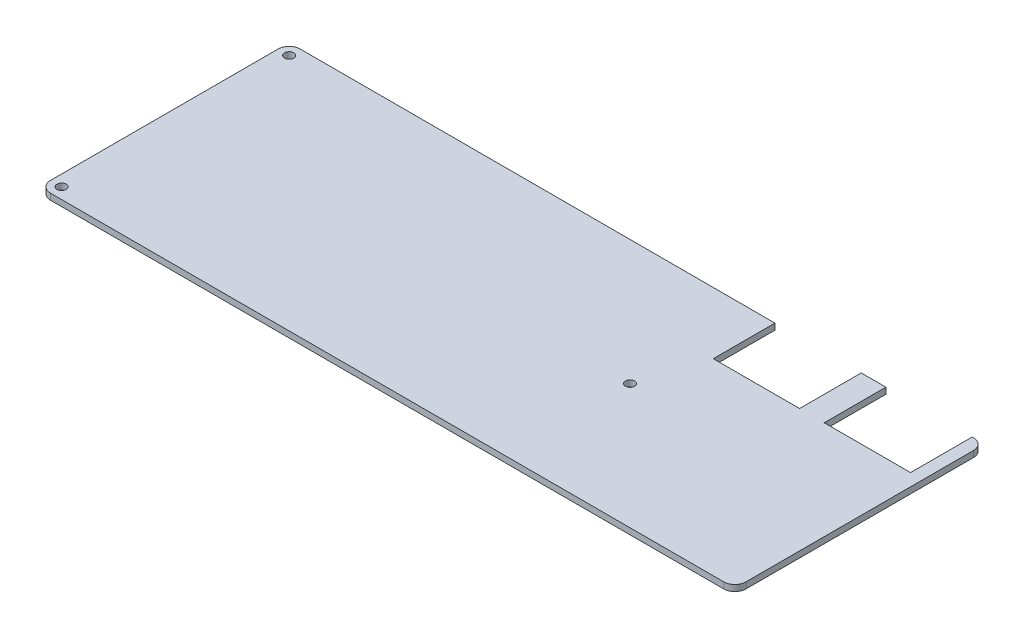
ISO-10303-21;
HEADER;
FILE_DESCRIPTION(('STEP AP214'),'2;1');
FILE_NAME('part.step','',(''),(''),'','','');
FILE_SCHEMA(('AUTOMOTIVE_DESIGN { 1 0 10303 214 1 1 1 1 }'));
ENDSEC;
DATA;
#1=APPLICATION_CONTEXT('core data for automotive mechanical design processes');
#2=APPLICATION_PROTOCOL_DEFINITION('international standard','automotive_design',2000,#1);
#3=PRODUCT_CONTEXT('',#1,'mechanical');
#4=PRODUCT('Part','Part','',(#3));
#5=PRODUCT_RELATED_PRODUCT_CATEGORY('part','',(#4));
#6=PRODUCT_DEFINITION_FORMATION('','',#4);
#7=PRODUCT_DEFINITION_CONTEXT('part definition',#1,'design');
#8=PRODUCT_DEFINITION('design','',#6,#7);
#9=PRODUCT_DEFINITION_SHAPE('','',#8);
#10=(LENGTH_UNIT() NAMED_UNIT(*) SI_UNIT(.MILLI.,.METRE.));
#11=(NAMED_UNIT(*) PLANE_ANGLE_UNIT() SI_UNIT($,.RADIAN.));
#12=(NAMED_UNIT(*) SI_UNIT($,.STERADIAN.) SOLID_ANGLE_UNIT());
#13=UNCERTAINTY_MEASURE_WITH_UNIT(LENGTH_MEASURE(1.E-05),#10,'distance_accuracy_value','');
#14=(GEOMETRIC_REPRESENTATION_CONTEXT(3) GLOBAL_UNCERTAINTY_ASSIGNED_CONTEXT((#13)) GLOBAL_UNIT_ASSIGNED_CONTEXT((#10,
#11,#12)) REPRESENTATION_CONTEXT('',''));
#15=CARTESIAN_POINT('',(0.,0.,0.));
#16=DIRECTION('',(0.,0.,1.));
#17=DIRECTION('',(1.,0.,0.));
#18=AXIS2_PLACEMENT_3D('',#15,#16,#17);
#19=CARTESIAN_POINT('',(-53.2002919708029,1.,21.1624817518249));
#20=DIRECTION('',(0.,-1.,0.));
#21=DIRECTION('',(0.,0.,-1.));
#22=AXIS2_PLACEMENT_3D('',#19,#20,#21);
#23=CYLINDRICAL_SURFACE('',#22,1.8);
#24=CARTESIAN_POINT('',(-53.2002919708029,0.,21.1624817518249));
#25=DIRECTION('',(0.,1.,0.));
#26=DIRECTION('',(0.,0.,1.));
#27=AXIS2_PLACEMENT_3D('',#24,#25,#26);
#28=CIRCLE('',#27,1.8);
#29=CARTESIAN_POINT('',(-53.2002919708029,0.,22.9624817518249));
#30=VERTEX_POINT('',#29);
#31=CARTESIAN_POINT('',(-55.0002919708029,0.,21.1624817518249));
#32=VERTEX_POINT('',#31);
#33=EDGE_CURVE('E193',#30,#32,#28,.F.);
#34=ORIENTED_EDGE('',*,*,#33,.F.);
#35=DIRECTION('',(0.,-1.,0.));
#36=VECTOR('',#35,1.);
#37=CARTESIAN_POINT('',(-53.2002919708029,1.,22.9624817518249));
#38=LINE('',#37,#36);
#39=CARTESIAN_POINT('',(-53.2002919708029,1.,22.9624817518249));
#40=VERTEX_POINT('',#39);
#41=EDGE_CURVE('E11',#40,#30,#38,.T.);
#42=ORIENTED_EDGE('',*,*,#41,.F.);
#43=CARTESIAN_POINT('',(-53.2002919708029,1.,21.1624817518249));
#44=DIRECTION('',(0.,1.,0.));
#45=DIRECTION('',(0.,0.,1.));
#46=AXIS2_PLACEMENT_3D('',#43,#44,#45);
#47=CIRCLE('',#46,1.8);
#48=CARTESIAN_POINT('',(-55.0002919708029,1.,21.1624817518249));
#49=VERTEX_POINT('',#48);
#50=EDGE_CURVE('E477',#40,#49,#47,.F.);
#51=ORIENTED_EDGE('',*,*,#50,.T.);
#52=DIRECTION('',(0.,-1.,0.));
#53=VECTOR('',#52,1.);
#54=CARTESIAN_POINT('',(-55.0002919708029,1.,21.1624817518249));
#55=LINE('',#54,#53);
#56=EDGE_CURVE('E113',#49,#32,#55,.T.);
#57=ORIENTED_EDGE('',*,*,#56,.T.);
#58=EDGE_LOOP('',(#34,#42,#51,#57));
#59=FACE_BOUND('',#58,.T.);
#60=ADVANCED_FACE('F38',(#59),#23,.T.);
#61=CARTESIAN_POINT('',(0.,1.,22.9624817518249));
#62=DIRECTION('',(0.,0.,-1.));
#63=DIRECTION('',(-1.,0.,0.));
#64=AXIS2_PLACEMENT_3D('',#61,#62,#63);
#65=PLANE('',#64);
#66=DIRECTION('',(1.,0.,0.));
#67=VECTOR('',#66,1.);
#68=CARTESIAN_POINT('',(0.,0.,22.9624817518249));
#69=LINE('',#68,#67);
#70=CARTESIAN_POINT('',(55.9997080291971,0.,22.9624817518249));
#71=VERTEX_POINT('',#70);
#72=EDGE_CURVE('E196',#30,#71,#69,.T.);
#73=ORIENTED_EDGE('',*,*,#72,.T.);
#74=DIRECTION('',(0.,-1.,0.));
#75=VECTOR('',#74,1.);
#76=CARTESIAN_POINT('',(55.9997080291971,1.,22.9624817518249));
#77=LINE('',#76,#75);
#78=CARTESIAN_POINT('',(55.9997080291971,1.,22.9624817518249));
#79=VERTEX_POINT('',#78);
#80=EDGE_CURVE('E47',#79,#71,#77,.T.);
#81=ORIENTED_EDGE('',*,*,#80,.F.);
#82=DIRECTION('',(1.,0.,0.));
#83=VECTOR('',#82,1.);
#84=CARTESIAN_POINT('',(0.,1.,22.9624817518249));
#85=LINE('',#84,#83);
#86=EDGE_CURVE('E478',#40,#79,#85,.T.);
#87=ORIENTED_EDGE('',*,*,#86,.F.);
#88=ORIENTED_EDGE('',*,*,#41,.T.);
#89=EDGE_LOOP('',(#73,#81,#87,#88));
#90=FACE_BOUND('',#89,.T.);
#91=ADVANCED_FACE('F266',(#90),#65,.F.);
#92=CARTESIAN_POINT('',(55.9997080291971,1.,21.1624817518249));
#93=DIRECTION('',(0.,-1.,0.));
#94=DIRECTION('',(0.,0.,-1.));
#95=AXIS2_PLACEMENT_3D('',#92,#93,#94);
#96=CYLINDRICAL_SURFACE('',#95,1.8);
#97=CARTESIAN_POINT('',(55.9997080291971,0.,21.1624817518249));
#98=DIRECTION('',(0.,1.,0.));
#99=DIRECTION('',(0.,0.,1.));
#100=AXIS2_PLACEMENT_3D('',#97,#98,#99);
#101=CIRCLE('',#100,1.8);
#102=CARTESIAN_POINT('',(57.7997080291971,0.,21.1624817518249));
#103=VERTEX_POINT('',#102);
#104=EDGE_CURVE('E199',#71,#103,#101,.T.);
#105=ORIENTED_EDGE('',*,*,#104,.T.);
#106=DIRECTION('',(0.,-1.,0.));
#107=VECTOR('',#106,1.);
#108=CARTESIAN_POINT('',(57.7997080291971,1.,21.1624817518249));
#109=LINE('',#108,#107);
#110=CARTESIAN_POINT('',(57.7997080291971,1.,21.1624817518249));
#111=VERTEX_POINT('',#110);
#112=EDGE_CURVE('E256',#111,#103,#109,.T.);
#113=ORIENTED_EDGE('',*,*,#112,.F.);
#114=CARTESIAN_POINT('',(55.9997080291971,1.,21.1624817518249));
#115=DIRECTION('',(0.,1.,0.));
#116=DIRECTION('',(0.,0.,1.));
#117=AXIS2_PLACEMENT_3D('',#114,#115,#116);
#118=CIRCLE('',#117,1.8);
#119=EDGE_CURVE('E262',#79,#111,#118,.T.);
#120=ORIENTED_EDGE('',*,*,#119,.F.);
#121=ORIENTED_EDGE('',*,*,#80,.T.);
#122=EDGE_LOOP('',(#105,#113,#120,#121));
#123=FACE_BOUND('',#122,.T.);
#124=ADVANCED_FACE('F260',(#123),#96,.T.);
#125=CARTESIAN_POINT('',(57.7997080291971,1.,0.));
#126=DIRECTION('',(1.,0.,0.));
#127=DIRECTION('',(0.,0.,-1.));
#128=AXIS2_PLACEMENT_3D('',#125,#126,#127);
#129=PLANE('',#128);
#130=DIRECTION('',(0.,0.,1.));
#131=VECTOR('',#130,1.);
#132=CARTESIAN_POINT('',(57.7997080291971,0.,0.));
#133=LINE('',#132,#131);
#134=CARTESIAN_POINT('',(57.7997080291971,0.,-15.7375182481751));
#135=VERTEX_POINT('',#134);
#136=EDGE_CURVE('E202',#135,#103,#133,.T.);
#137=ORIENTED_EDGE('',*,*,#136,.F.);
#138=DIRECTION('',(0.,-1.,0.));
#139=VECTOR('',#138,1.);
#140=CARTESIAN_POINT('',(57.7997080291971,1.,-15.7375182481751));
#141=LINE('',#140,#139);
#142=CARTESIAN_POINT('',(57.7997080291971,1.,-15.7375182481751));
#143=VERTEX_POINT('',#142);
#144=EDGE_CURVE('E254',#143,#135,#141,.T.);
#145=ORIENTED_EDGE('',*,*,#144,.F.);
#146=DIRECTION('',(0.,0.,1.));
#147=VECTOR('',#146,1.);
#148=CARTESIAN_POINT('',(57.7997080291971,1.,0.));
#149=LINE('',#148,#147);
#150=EDGE_CURVE('E487',#143,#111,#149,.T.);
#151=ORIENTED_EDGE('',*,*,#150,.T.);
#152=ORIENTED_EDGE('',*,*,#112,.T.);
#153=EDGE_LOOP('',(#137,#145,#151,#152));
#154=FACE_BOUND('',#153,.T.);
#155=ADVANCED_FACE('F341',(#154),#129,.T.);
#156=CARTESIAN_POINT('',(55.9997080291971,1.,-15.7375182481751));
#157=DIRECTION('',(0.,-1.,0.));
#158=DIRECTION('',(0.,0.,-1.));
#159=AXIS2_PLACEMENT_3D('',#156,#157,#158);
#160=CYLINDRICAL_SURFACE('',#159,1.8);
#161=CARTESIAN_POINT('',(55.9997080291971,0.,-15.7375182481751));
#162=DIRECTION('',(0.,1.,0.));
#163=DIRECTION('',(0.,0.,1.));
#164=AXIS2_PLACEMENT_3D('',#161,#162,#163);
#165=CIRCLE('',#164,1.8);
#166=CARTESIAN_POINT('',(55.9997080291971,0.,-17.5375182481751));
#167=VERTEX_POINT('',#166);
#168=EDGE_CURVE('E205',#135,#167,#165,.T.);
#169=ORIENTED_EDGE('',*,*,#168,.T.);
#170=DIRECTION('',(0.,-1.,0.));
#171=VECTOR('',#170,1.);
#172=CARTESIAN_POINT('',(55.9997080291971,1.,-17.5375182481751));
#173=LINE('',#172,#171);
#174=CARTESIAN_POINT('',(55.9997080291971,1.,-17.5375182481751));
#175=VERTEX_POINT('',#174);
#176=EDGE_CURVE('E252',#175,#167,#173,.T.);
#177=ORIENTED_EDGE('',*,*,#176,.F.);
#178=CARTESIAN_POINT('',(55.9997080291971,1.,-15.7375182481751));
#179=DIRECTION('',(0.,1.,0.));
#180=DIRECTION('',(0.,0.,1.));
#181=AXIS2_PLACEMENT_3D('',#178,#179,#180);
#182=CIRCLE('',#181,1.8);
#183=EDGE_CURVE('E490',#143,#175,#182,.T.);
#184=ORIENTED_EDGE('',*,*,#183,.F.);
#185=ORIENTED_EDGE('',*,*,#144,.T.);
#186=EDGE_LOOP('',(#169,#177,#184,#185));
#187=FACE_BOUND('',#186,.T.);
#188=ADVANCED_FACE('F338',(#187),#160,.T.);
#189=CARTESIAN_POINT('',(0.,1.,-17.5375182481751));
#190=DIRECTION('',(0.,0.,-1.));
#191=DIRECTION('',(-1.,0.,0.));
#192=AXIS2_PLACEMENT_3D('',#189,#190,#191);
#193=PLANE('',#192);
#194=DIRECTION('',(1.,0.,0.));
#195=VECTOR('',#194,1.);
#196=CARTESIAN_POINT('',(0.,0.,-17.5375182481751));
#197=LINE('',#196,#195);
#198=CARTESIAN_POINT('',(55.7997080291971,0.,-17.5375182481751));
#199=VERTEX_POINT('',#198);
#200=EDGE_CURVE('E208',#199,#167,#197,.T.);
#201=ORIENTED_EDGE('',*,*,#200,.F.);
#202=DIRECTION('',(0.,-1.,0.));
#203=VECTOR('',#202,1.);
#204=CARTESIAN_POINT('',(55.7997080291971,1.,-17.5375182481751));
#205=LINE('',#204,#203);
#206=CARTESIAN_POINT('',(55.7997080291971,1.,-17.5375182481751));
#207=VERTEX_POINT('',#206);
#208=EDGE_CURVE('E250',#207,#199,#205,.T.);
#209=ORIENTED_EDGE('',*,*,#208,.F.);
#210=DIRECTION('',(1.,0.,0.));
#211=VECTOR('',#210,1.);
#212=CARTESIAN_POINT('',(0.,1.,-17.5375182481751));
#213=LINE('',#212,#211);
#214=EDGE_CURVE('E177',#207,#175,#213,.T.);
#215=ORIENTED_EDGE('',*,*,#214,.T.);
#216=ORIENTED_EDGE('',*,*,#176,.T.);
#217=EDGE_LOOP('',(#201,#209,#215,#216));
#218=FACE_BOUND('',#217,.T.);
#219=ADVANCED_FACE('F313',(#218),#193,.T.);
#220=CARTESIAN_POINT('',(55.7997080291971,1.,0.));
#221=DIRECTION('',(1.,0.,0.));
#222=DIRECTION('',(0.,0.,-1.));
#223=AXIS2_PLACEMENT_3D('',#220,#221,#222);
#224=PLANE('',#223);
#225=DIRECTION('',(0.,0.,1.));
#226=VECTOR('',#225,1.);
#227=CARTESIAN_POINT('',(55.7997080291971,0.,0.));
#228=LINE('',#227,#226);
#229=CARTESIAN_POINT('',(55.7997080291971,0.,-7.53751824817513));
#230=VERTEX_POINT('',#229);
#231=EDGE_CURVE('E211',#199,#230,#228,.T.);
#232=ORIENTED_EDGE('',*,*,#231,.T.);
#233=DIRECTION('',(0.,-1.,0.));
#234=VECTOR('',#233,1.);
#235=CARTESIAN_POINT('',(55.7997080291971,1.,-7.53751824817513));
#236=LINE('',#235,#234);
#237=CARTESIAN_POINT('',(55.7997080291971,1.,-7.53751824817513));
#238=VERTEX_POINT('',#237);
#239=EDGE_CURVE('E248',#238,#230,#236,.T.);
#240=ORIENTED_EDGE('',*,*,#239,.F.);
#241=DIRECTION('',(0.,0.,1.));
#242=VECTOR('',#241,1.);
#243=CARTESIAN_POINT('',(55.7997080291971,1.,0.));
#244=LINE('',#243,#242);
#245=EDGE_CURVE('E493',#207,#238,#244,.T.);
#246=ORIENTED_EDGE('',*,*,#245,.F.);
#247=ORIENTED_EDGE('',*,*,#208,.T.);
#248=EDGE_LOOP('',(#232,#240,#246,#247));
#249=FACE_BOUND('',#248,.T.);
#250=ADVANCED_FACE('F333',(#249),#224,.F.);
#251=CARTESIAN_POINT('',(0.,1.,-7.53751824817513));
#252=DIRECTION('',(0.,0.,-1.));
#253=DIRECTION('',(-1.,0.,0.));
#254=AXIS2_PLACEMENT_3D('',#251,#252,#253);
#255=PLANE('',#254);
#256=DIRECTION('',(1.,0.,0.));
#257=VECTOR('',#256,1.);
#258=CARTESIAN_POINT('',(0.,0.,-7.53751824817513));
#259=LINE('',#258,#257);
#260=CARTESIAN_POINT('',(41.7997080291971,0.,-7.53751824817513));
#261=VERTEX_POINT('',#260);
#262=EDGE_CURVE('E215',#261,#230,#259,.T.);
#263=ORIENTED_EDGE('',*,*,#262,.F.);
#264=DIRECTION('',(0.,-1.,0.));
#265=VECTOR('',#264,1.);
#266=CARTESIAN_POINT('',(41.7997080291971,1.,-7.53751824817513));
#267=LINE('',#266,#265);
#268=CARTESIAN_POINT('',(41.7997080291971,1.,-7.53751824817513));
#269=VERTEX_POINT('',#268);
#270=EDGE_CURVE('E246',#269,#261,#267,.T.);
#271=ORIENTED_EDGE('',*,*,#270,.F.);
#272=DIRECTION('',(1.,0.,0.));
#273=VECTOR('',#272,1.);
#274=CARTESIAN_POINT('',(0.,1.,-7.53751824817513));
#275=LINE('',#274,#273);
#276=EDGE_CURVE('E495',#269,#238,#275,.T.);
#277=ORIENTED_EDGE('',*,*,#276,.T.);
#278=ORIENTED_EDGE('',*,*,#239,.T.);
#279=EDGE_LOOP('',(#263,#271,#277,#278));
#280=FACE_BOUND('',#279,.T.);
#281=ADVANCED_FACE('F329',(#280),#255,.T.);
#282=CARTESIAN_POINT('',(41.7997080291971,1.,0.));
#283=DIRECTION('',(1.,0.,0.));
#284=DIRECTION('',(0.,0.,-1.));
#285=AXIS2_PLACEMENT_3D('',#282,#283,#284);
#286=PLANE('',#285);
#287=DIRECTION('',(0.,0.,1.));
#288=VECTOR('',#287,1.);
#289=CARTESIAN_POINT('',(41.7997080291971,0.,0.));
#290=LINE('',#289,#288);
#291=CARTESIAN_POINT('',(41.7997080291971,0.,-17.5375182481751));
#292=VERTEX_POINT('',#291);
#293=EDGE_CURVE('E218',#292,#261,#290,.T.);
#294=ORIENTED_EDGE('',*,*,#293,.F.);
#295=DIRECTION('',(0.,-1.,0.));
#296=VECTOR('',#295,1.);
#297=CARTESIAN_POINT('',(41.7997080291971,1.,-17.5375182481751));
#298=LINE('',#297,#296);
#299=CARTESIAN_POINT('',(41.7997080291971,1.,-17.5375182481751));
#300=VERTEX_POINT('',#299);
#301=EDGE_CURVE('E244',#300,#292,#298,.T.);
#302=ORIENTED_EDGE('',*,*,#301,.F.);
#303=DIRECTION('',(0.,0.,1.));
#304=VECTOR('',#303,1.);
#305=CARTESIAN_POINT('',(41.7997080291971,1.,0.));
#306=LINE('',#305,#304);
#307=EDGE_CURVE('E498',#300,#269,#306,.T.);
#308=ORIENTED_EDGE('',*,*,#307,.T.);
#309=ORIENTED_EDGE('',*,*,#270,.T.);
#310=EDGE_LOOP('',(#294,#302,#308,#309));
#311=FACE_BOUND('',#310,.T.);
#312=ADVANCED_FACE('F326',(#311),#286,.T.);
#313=CARTESIAN_POINT('',(37.7997080291971,0.,-17.5375182481751));
#314=VERTEX_POINT('',#313);
#315=EDGE_CURVE('E212',#314,#292,#197,.T.);
#316=ORIENTED_EDGE('',*,*,#315,.F.);
#317=DIRECTION('',(0.,-1.,0.));
#318=VECTOR('',#317,1.);
#319=CARTESIAN_POINT('',(37.7997080291971,1.,-17.5375182481751));
#320=LINE('',#319,#318);
#321=CARTESIAN_POINT('',(37.7997080291971,1.,-17.5375182481751));
#322=VERTEX_POINT('',#321);
#323=EDGE_CURVE('E242',#322,#314,#320,.T.);
#324=ORIENTED_EDGE('',*,*,#323,.F.);
#325=EDGE_CURVE('E176',#322,#300,#213,.T.);
#326=ORIENTED_EDGE('',*,*,#325,.T.);
#327=ORIENTED_EDGE('',*,*,#301,.T.);
#328=EDGE_LOOP('',(#316,#324,#326,#327));
#329=FACE_BOUND('',#328,.T.);
#330=ADVANCED_FACE('F314',(#329),#193,.T.);
#331=CARTESIAN_POINT('',(37.7997080291971,1.,0.));
#332=DIRECTION('',(1.,0.,0.));
#333=DIRECTION('',(0.,0.,-1.));
#334=AXIS2_PLACEMENT_3D('',#331,#332,#333);
#335=PLANE('',#334);
#336=DIRECTION('',(0.,0.,1.));
#337=VECTOR('',#336,1.);
#338=CARTESIAN_POINT('',(37.7997080291971,0.,0.));
#339=LINE('',#338,#337);
#340=CARTESIAN_POINT('',(37.7997080291971,0.,-7.53751824817513));
#341=VERTEX_POINT('',#340);
#342=EDGE_CURVE('E221',#314,#341,#339,.T.);
#343=ORIENTED_EDGE('',*,*,#342,.T.);
#344=DIRECTION('',(0.,-1.,0.));
#345=VECTOR('',#344,1.);
#346=CARTESIAN_POINT('',(37.7997080291971,1.,-7.53751824817513));
#347=LINE('',#346,#345);
#348=CARTESIAN_POINT('',(37.7997080291971,1.,-7.53751824817513));
#349=VERTEX_POINT('',#348);
#350=EDGE_CURVE('E240',#349,#341,#347,.T.);
#351=ORIENTED_EDGE('',*,*,#350,.F.);
#352=DIRECTION('',(0.,0.,1.));
#353=VECTOR('',#352,1.);
#354=CARTESIAN_POINT('',(37.7997080291971,1.,0.));
#355=LINE('',#354,#353);
#356=EDGE_CURVE('E501',#322,#349,#355,.T.);
#357=ORIENTED_EDGE('',*,*,#356,.F.);
#358=ORIENTED_EDGE('',*,*,#323,.T.);
#359=EDGE_LOOP('',(#343,#351,#357,#358));
#360=FACE_BOUND('',#359,.T.);
#361=ADVANCED_FACE('F321',(#360),#335,.F.);
#362=CARTESIAN_POINT('',(0.,1.,-7.53751824817513));
#363=DIRECTION('',(0.,0.,-1.));
#364=DIRECTION('',(-1.,0.,0.));
#365=AXIS2_PLACEMENT_3D('',#362,#363,#364);
#366=PLANE('',#365);
#367=DIRECTION('',(1.,0.,0.));
#368=VECTOR('',#367,1.);
#369=CARTESIAN_POINT('',(0.,0.,-7.53751824817513));
#370=LINE('',#369,#368);
#371=CARTESIAN_POINT('',(23.7997080291971,0.,-7.53751824817513));
#372=VERTEX_POINT('',#371);
#373=EDGE_CURVE('E224',#372,#341,#370,.T.);
#374=ORIENTED_EDGE('',*,*,#373,.F.);
#375=DIRECTION('',(0.,-1.,0.));
#376=VECTOR('',#375,1.);
#377=CARTESIAN_POINT('',(23.7997080291971,1.,-7.53751824817513));
#378=LINE('',#377,#376);
#379=CARTESIAN_POINT('',(23.7997080291971,1.,-7.53751824817513));
#380=VERTEX_POINT('',#379);
#381=EDGE_CURVE('E238',#380,#372,#378,.T.);
#382=ORIENTED_EDGE('',*,*,#381,.F.);
#383=DIRECTION('',(1.,0.,0.));
#384=VECTOR('',#383,1.);
#385=CARTESIAN_POINT('',(0.,1.,-7.53751824817513));
#386=LINE('',#385,#384);
#387=EDGE_CURVE('E502',#380,#349,#386,.T.);
#388=ORIENTED_EDGE('',*,*,#387,.T.);
#389=ORIENTED_EDGE('',*,*,#350,.T.);
#390=EDGE_LOOP('',(#374,#382,#388,#389));
#391=FACE_BOUND('',#390,.T.);
#392=ADVANCED_FACE('F317',(#391),#366,.T.);
#393=CARTESIAN_POINT('',(23.7997080291971,1.,0.));
#394=DIRECTION('',(1.,0.,0.));
#395=DIRECTION('',(0.,0.,-1.));
#396=AXIS2_PLACEMENT_3D('',#393,#394,#395);
#397=PLANE('',#396);
#398=DIRECTION('',(0.,0.,1.));
#399=VECTOR('',#398,1.);
#400=CARTESIAN_POINT('',(23.7997080291971,0.,0.));
#401=LINE('',#400,#399);
#402=CARTESIAN_POINT('',(23.7997080291971,0.,-17.5375182481751));
#403=VERTEX_POINT('',#402);
#404=EDGE_CURVE('E227',#403,#372,#401,.T.);
#405=ORIENTED_EDGE('',*,*,#404,.F.);
#406=DIRECTION('',(0.,-1.,0.));
#407=VECTOR('',#406,1.);
#408=CARTESIAN_POINT('',(23.7997080291971,1.,-17.5375182481751));
#409=LINE('',#408,#407);
#410=CARTESIAN_POINT('',(23.7997080291971,1.,-17.5375182481751));
#411=VERTEX_POINT('',#410);
#412=EDGE_CURVE('E167',#411,#403,#409,.T.);
#413=ORIENTED_EDGE('',*,*,#412,.F.);
#414=DIRECTION('',(0.,0.,1.));
#415=VECTOR('',#414,1.);
#416=CARTESIAN_POINT('',(23.7997080291971,1.,0.));
#417=LINE('',#416,#415);
#418=EDGE_CURVE('E174',#411,#380,#417,.T.);
#419=ORIENTED_EDGE('',*,*,#418,.T.);
#420=ORIENTED_EDGE('',*,*,#381,.T.);
#421=EDGE_LOOP('',(#405,#413,#419,#420));
#422=FACE_BOUND('',#421,.T.);
#423=ADVANCED_FACE('F312',(#422),#397,.T.);
#424=CARTESIAN_POINT('',(-53.2002919708029,0.,-17.5375182481751));
#425=VERTEX_POINT('',#424);
#426=EDGE_CURVE('E162',#425,#403,#197,.T.);
#427=ORIENTED_EDGE('',*,*,#426,.F.);
#428=DIRECTION('',(0.,-1.,0.));
#429=VECTOR('',#428,1.);
#430=CARTESIAN_POINT('',(-53.2002919708029,1.,-17.5375182481751));
#431=LINE('',#430,#429);
#432=CARTESIAN_POINT('',(-53.2002919708029,1.,-17.5375182481751));
#433=VERTEX_POINT('',#432);
#434=EDGE_CURVE('E157',#433,#425,#431,.T.);
#435=ORIENTED_EDGE('',*,*,#434,.F.);
#436=EDGE_CURVE('E160',#433,#411,#213,.T.);
#437=ORIENTED_EDGE('',*,*,#436,.T.);
#438=ORIENTED_EDGE('',*,*,#412,.T.);
#439=EDGE_LOOP('',(#427,#435,#437,#438));
#440=FACE_BOUND('',#439,.T.);
#441=ADVANCED_FACE('F159',(#440),#193,.T.);
#442=CARTESIAN_POINT('',(-53.2002919708029,1.,-15.7375182481751));
#443=DIRECTION('',(0.,-1.,0.));
#444=DIRECTION('',(0.,0.,-1.));
#445=AXIS2_PLACEMENT_3D('',#442,#443,#444);
#446=CYLINDRICAL_SURFACE('',#445,1.8);
#447=CARTESIAN_POINT('',(-53.2002919708029,0.,-15.7375182481751));
#448=DIRECTION('',(0.,1.,0.));
#449=DIRECTION('',(0.,0.,1.));
#450=AXIS2_PLACEMENT_3D('',#447,#448,#449);
#451=CIRCLE('',#450,1.8);
#452=CARTESIAN_POINT('',(-55.0002919708029,0.,-15.7375182481751));
#453=VERTEX_POINT('',#452);
#454=EDGE_CURVE('E230',#453,#425,#451,.F.);
#455=ORIENTED_EDGE('',*,*,#454,.F.);
#456=DIRECTION('',(0.,-1.,0.));
#457=VECTOR('',#456,1.);
#458=CARTESIAN_POINT('',(-55.0002919708029,1.,-15.7375182481751));
#459=LINE('',#458,#457);
#460=CARTESIAN_POINT('',(-55.0002919708029,1.,-15.7375182481751));
#461=VERTEX_POINT('',#460);
#462=EDGE_CURVE('E106',#461,#453,#459,.T.);
#463=ORIENTED_EDGE('',*,*,#462,.F.);
#464=CARTESIAN_POINT('',(-53.2002919708029,1.,-15.7375182481751));
#465=DIRECTION('',(0.,1.,0.));
#466=DIRECTION('',(0.,0.,1.));
#467=AXIS2_PLACEMENT_3D('',#464,#465,#466);
#468=CIRCLE('',#467,1.8);
#469=EDGE_CURVE('E171',#461,#433,#468,.F.);
#470=ORIENTED_EDGE('',*,*,#469,.T.);
#471=ORIENTED_EDGE('',*,*,#434,.T.);
#472=EDGE_LOOP('',(#455,#463,#470,#471));
#473=FACE_BOUND('',#472,.T.);
#474=ADVANCED_FACE('F178',(#473),#446,.T.);
#475=CARTESIAN_POINT('',(-53.2002919708029,1.,21.1624817518249));
#476=DIRECTION('',(0.,-1.,0.));
#477=DIRECTION('',(0.,0.,-1.));
#478=AXIS2_PLACEMENT_3D('',#475,#476,#477);
#479=CYLINDRICAL_SURFACE('',#478,0.749999999999999);
#480=CARTESIAN_POINT('',(-53.2002919708029,1.,21.1624817518249));
#481=DIRECTION('',(0.,1.,0.));
#482=DIRECTION('',(0.,0.,1.));
#483=AXIS2_PLACEMENT_3D('',#480,#481,#482);
#484=CIRCLE('',#483,0.749999999999999);
#485=CARTESIAN_POINT('',(-53.2002919708029,1.,21.9124817518249));
#486=VERTEX_POINT('',#485);
#487=EDGE_CURVE('E479',#486,#486,#484,.T.);
#488=ORIENTED_EDGE('',*,*,#487,.T.);
#489=EDGE_LOOP('',(#488));
#490=FACE_BOUND('',#489,.T.);
#491=CARTESIAN_POINT('',(-53.2002919708029,0.,21.1624817518249));
#492=DIRECTION('',(0.,1.,0.));
#493=DIRECTION('',(0.,0.,1.));
#494=AXIS2_PLACEMENT_3D('',#491,#492,#493);
#495=CIRCLE('',#494,0.749999999999999);
#496=CARTESIAN_POINT('',(-53.2002919708029,0.,21.9124817518249));
#497=VERTEX_POINT('',#496);
#498=EDGE_CURVE('E190',#497,#497,#495,.T.);
#499=ORIENTED_EDGE('',*,*,#498,.F.);
#500=EDGE_LOOP('',(#499));
#501=FACE_BOUND('',#500,.T.);
#502=ADVANCED_FACE('F277',(#490,#501),#479,.F.);
#503=CARTESIAN_POINT('',(-53.2002919708029,1.,-15.7375182481751));
#504=DIRECTION('',(0.,-1.,0.));
#505=DIRECTION('',(0.,0.,-1.));
#506=AXIS2_PLACEMENT_3D('',#503,#504,#505);
#507=CYLINDRICAL_SURFACE('',#506,0.749999999999999);
#508=CARTESIAN_POINT('',(-53.2002919708029,1.,-15.7375182481751));
#509=DIRECTION('',(0.,1.,0.));
#510=DIRECTION('',(0.,0.,1.));
#511=AXIS2_PLACEMENT_3D('',#508,#509,#510);
#512=CIRCLE('',#511,0.749999999999999);
#513=CARTESIAN_POINT('',(-53.2002919708029,1.,-14.9875182481751));
#514=VERTEX_POINT('',#513);
#515=EDGE_CURVE('E291',#514,#514,#512,.T.);
#516=ORIENTED_EDGE('',*,*,#515,.T.);
#517=EDGE_LOOP('',(#516));
#518=FACE_BOUND('',#517,.T.);
#519=CARTESIAN_POINT('',(-53.2002919708029,0.,-15.7375182481751));
#520=DIRECTION('',(0.,1.,0.));
#521=DIRECTION('',(0.,0.,1.));
#522=AXIS2_PLACEMENT_3D('',#519,#520,#521);
#523=CIRCLE('',#522,0.749999999999999);
#524=CARTESIAN_POINT('',(-53.2002919708029,0.,-14.9875182481751));
#525=VERTEX_POINT('',#524);
#526=EDGE_CURVE('E187',#525,#525,#523,.T.);
#527=ORIENTED_EDGE('',*,*,#526,.F.);
#528=EDGE_LOOP('',(#527));
#529=FACE_BOUND('',#528,.T.);
#530=ADVANCED_FACE('F279',(#518,#529),#507,.F.);
#531=CARTESIAN_POINT('',(20.5497080291971,1.,2.71248175182487));
#532=DIRECTION('',(0.,-1.,0.));
#533=DIRECTION('',(0.,0.,-1.));
#534=AXIS2_PLACEMENT_3D('',#531,#532,#533);
#535=CYLINDRICAL_SURFACE('',#534,0.750000000000002);
#536=CARTESIAN_POINT('',(20.5497080291971,1.,2.71248175182487));
#537=DIRECTION('',(0.,1.,0.));
#538=DIRECTION('',(0.,0.,1.));
#539=AXIS2_PLACEMENT_3D('',#536,#537,#538);
#540=CIRCLE('',#539,0.750000000000002);
#541=CARTESIAN_POINT('',(20.5497080291971,1.,3.46248175182487));
#542=VERTEX_POINT('',#541);
#543=EDGE_CURVE('E234',#542,#542,#540,.T.);
#544=ORIENTED_EDGE('',*,*,#543,.T.);
#545=EDGE_LOOP('',(#544));
#546=FACE_BOUND('',#545,.T.);
#547=CARTESIAN_POINT('',(20.5497080291971,0.,2.71248175182487));
#548=DIRECTION('',(0.,1.,0.));
#549=DIRECTION('',(0.,0.,1.));
#550=AXIS2_PLACEMENT_3D('',#547,#548,#549);
#551=CIRCLE('',#550,0.750000000000002);
#552=CARTESIAN_POINT('',(20.5497080291971,0.,3.46248175182487));
#553=VERTEX_POINT('',#552);
#554=EDGE_CURVE('E184',#553,#553,#551,.T.);
#555=ORIENTED_EDGE('',*,*,#554,.F.);
#556=EDGE_LOOP('',(#555));
#557=FACE_BOUND('',#556,.T.);
#558=ADVANCED_FACE('F40',(#546,#557),#535,.F.);
#559=CARTESIAN_POINT('',(-55.0002919708029,1.,0.));
#560=DIRECTION('',(1.,0.,0.));
#561=DIRECTION('',(0.,0.,-1.));
#562=AXIS2_PLACEMENT_3D('',#559,#560,#561);
#563=PLANE('',#562);
#564=DIRECTION('',(0.,0.,1.));
#565=VECTOR('',#564,1.);
#566=CARTESIAN_POINT('',(-55.0002919708029,0.,0.));
#567=LINE('',#566,#565);
#568=EDGE_CURVE('E232',#453,#32,#567,.T.);
#569=ORIENTED_EDGE('',*,*,#568,.T.);
#570=ORIENTED_EDGE('',*,*,#56,.F.);
#571=DIRECTION('',(0.,0.,1.));
#572=VECTOR('',#571,1.);
#573=CARTESIAN_POINT('',(-55.0002919708029,1.,0.));
#574=LINE('',#573,#572);
#575=EDGE_CURVE('E55',#461,#49,#574,.T.);
#576=ORIENTED_EDGE('',*,*,#575,.F.);
#577=ORIENTED_EDGE('',*,*,#462,.T.);
#578=EDGE_LOOP('',(#569,#570,#576,#577));
#579=FACE_BOUND('',#578,.T.);
#580=ADVANCED_FACE('F286',(#579),#563,.F.);
#581=CARTESIAN_POINT('',(0.,1.,0.));
#582=DIRECTION('',(0.,1.,0.));
#583=DIRECTION('',(0.,0.,1.));
#584=AXIS2_PLACEMENT_3D('',#581,#582,#583);
#585=PLANE('',#584);
#586=ORIENTED_EDGE('',*,*,#543,.F.);
#587=EDGE_LOOP('',(#586));
#588=FACE_BOUND('',#587,.T.);
#589=ORIENTED_EDGE('',*,*,#515,.F.);
#590=EDGE_LOOP('',(#589));
#591=FACE_BOUND('',#590,.T.);
#592=ORIENTED_EDGE('',*,*,#487,.F.);
#593=EDGE_LOOP('',(#592));
#594=FACE_BOUND('',#593,.T.);
#595=ORIENTED_EDGE('',*,*,#50,.F.);
#596=ORIENTED_EDGE('',*,*,#86,.T.);
#597=ORIENTED_EDGE('',*,*,#119,.T.);
#598=ORIENTED_EDGE('',*,*,#150,.F.);
#599=ORIENTED_EDGE('',*,*,#183,.T.);
#600=ORIENTED_EDGE('',*,*,#214,.F.);
#601=ORIENTED_EDGE('',*,*,#245,.T.);
#602=ORIENTED_EDGE('',*,*,#276,.F.);
#603=ORIENTED_EDGE('',*,*,#307,.F.);
#604=ORIENTED_EDGE('',*,*,#325,.F.);
#605=ORIENTED_EDGE('',*,*,#356,.T.);
#606=ORIENTED_EDGE('',*,*,#387,.F.);
#607=ORIENTED_EDGE('',*,*,#418,.F.);
#608=ORIENTED_EDGE('',*,*,#436,.F.);
#609=ORIENTED_EDGE('',*,*,#469,.F.);
#610=ORIENTED_EDGE('',*,*,#575,.T.);
#611=EDGE_LOOP('',(#595,#596,#597,#598,#599,#600,#601,#602,#603,#604,#605,#606,#607,#608,#609,#610));
#612=FACE_BOUND('',#611,.T.);
#613=ADVANCED_FACE('F170',(#588,#591,#594,#612),#585,.T.);
#614=CARTESIAN_POINT('',(0.,0.,0.));
#615=DIRECTION('',(0.,1.,0.));
#616=DIRECTION('',(0.,0.,1.));
#617=AXIS2_PLACEMENT_3D('',#614,#615,#616);
#618=PLANE('',#617);
#619=ORIENTED_EDGE('',*,*,#554,.T.);
#620=EDGE_LOOP('',(#619));
#621=FACE_BOUND('',#620,.T.);
#622=ORIENTED_EDGE('',*,*,#526,.T.);
#623=EDGE_LOOP('',(#622));
#624=FACE_BOUND('',#623,.T.);
#625=ORIENTED_EDGE('',*,*,#498,.T.);
#626=EDGE_LOOP('',(#625));
#627=FACE_BOUND('',#626,.T.);
#628=ORIENTED_EDGE('',*,*,#33,.T.);
#629=ORIENTED_EDGE('',*,*,#568,.F.);
#630=ORIENTED_EDGE('',*,*,#454,.T.);
#631=ORIENTED_EDGE('',*,*,#426,.T.);
#632=ORIENTED_EDGE('',*,*,#404,.T.);
#633=ORIENTED_EDGE('',*,*,#373,.T.);
#634=ORIENTED_EDGE('',*,*,#342,.F.);
#635=ORIENTED_EDGE('',*,*,#315,.T.);
#636=ORIENTED_EDGE('',*,*,#293,.T.);
#637=ORIENTED_EDGE('',*,*,#262,.T.);
#638=ORIENTED_EDGE('',*,*,#231,.F.);
#639=ORIENTED_EDGE('',*,*,#200,.T.);
#640=ORIENTED_EDGE('',*,*,#168,.F.);
#641=ORIENTED_EDGE('',*,*,#136,.T.);
#642=ORIENTED_EDGE('',*,*,#104,.F.);
#643=ORIENTED_EDGE('',*,*,#72,.F.);
#644=EDGE_LOOP('',(#628,#629,#630,#631,#632,#633,#634,#635,#636,#637,#638,#639,#640,#641,#642,#643));
#645=FACE_BOUND('',#644,.T.);
#646=ADVANCED_FACE('F268',(#621,#624,#627,#645),#618,.F.);
#647=CLOSED_SHELL('',(#60,#91,#124,#155,#188,#219,#250,#281,#312,#330,#361,#392,#423,#441,#474,
#502,#530,#558,#580,#613,#646));
#648=MANIFOLD_SOLID_BREP('B2',#647);
#649=ADVANCED_BREP_SHAPE_REPRESENTATION('',(#18,#648),#14);
#650=SHAPE_DEFINITION_REPRESENTATION(#9,#649);
ENDSEC;
END-ISO-10303-21;
